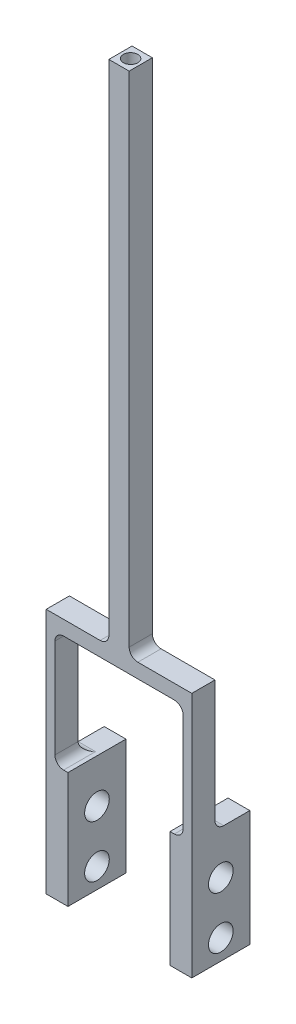
ISO-10303-21;
HEADER;
FILE_DESCRIPTION(('STEP AP214'),'2;1');
FILE_NAME('part.step','',(''),(''),'','','');
FILE_SCHEMA(('AUTOMOTIVE_DESIGN { 1 0 10303 214 1 1 1 1 }'));
ENDSEC;
DATA;
#1=APPLICATION_CONTEXT('core data for automotive mechanical design processes');
#2=APPLICATION_PROTOCOL_DEFINITION('international standard','automotive_design',2000,#1);
#3=PRODUCT_CONTEXT('',#1,'mechanical');
#4=PRODUCT('Part','Part','',(#3));
#5=PRODUCT_RELATED_PRODUCT_CATEGORY('part','',(#4));
#6=PRODUCT_DEFINITION_FORMATION('','',#4);
#7=PRODUCT_DEFINITION_CONTEXT('part definition',#1,'design');
#8=PRODUCT_DEFINITION('design','',#6,#7);
#9=PRODUCT_DEFINITION_SHAPE('','',#8);
#10=(LENGTH_UNIT() NAMED_UNIT(*) SI_UNIT(.MILLI.,.METRE.));
#11=(NAMED_UNIT(*) PLANE_ANGLE_UNIT() SI_UNIT($,.RADIAN.));
#12=(NAMED_UNIT(*) SI_UNIT($,.STERADIAN.) SOLID_ANGLE_UNIT());
#13=UNCERTAINTY_MEASURE_WITH_UNIT(LENGTH_MEASURE(1.E-05),#10,'distance_accuracy_value','');
#14=(GEOMETRIC_REPRESENTATION_CONTEXT(3) GLOBAL_UNCERTAINTY_ASSIGNED_CONTEXT((#13)) GLOBAL_UNIT_ASSIGNED_CONTEXT((#10,
#11,#12)) REPRESENTATION_CONTEXT('',''));
#15=CARTESIAN_POINT('',(0.,0.,0.));
#16=DIRECTION('',(0.,0.,1.));
#17=DIRECTION('',(1.,0.,0.));
#18=AXIS2_PLACEMENT_3D('',#15,#16,#17);
#19=CARTESIAN_POINT('',(0.,0.,-10.));
#20=DIRECTION('',(0.,0.,1.));
#21=DIRECTION('',(1.,0.,0.));
#22=AXIS2_PLACEMENT_3D('',#19,#20,#21);
#23=PLANE('',#22);
#24=DIRECTION('',(0.,1.,0.));
#25=VECTOR('',#24,1.);
#26=CARTESIAN_POINT('',(-25.1,0.,-10.));
#27=LINE('',#26,#25);
#28=CARTESIAN_POINT('',(-25.1,0.,-10.));
#29=VERTEX_POINT('',#28);
#30=CARTESIAN_POINT('',(-25.1,40.,-10.));
#31=VERTEX_POINT('',#30);
#32=EDGE_CURVE('E415',#29,#31,#27,.T.);
#33=ORIENTED_EDGE('',*,*,#32,.T.);
#34=DIRECTION('',(-1.,0.,0.));
#35=VECTOR('',#34,1.);
#36=CARTESIAN_POINT('',(0.,40.,-10.));
#37=LINE('',#36,#35);
#38=CARTESIAN_POINT('',(-17.6,40.,-10.));
#39=VERTEX_POINT('',#38);
#40=EDGE_CURVE('E427',#39,#31,#37,.T.);
#41=ORIENTED_EDGE('',*,*,#40,.F.);
#42=DIRECTION('',(0.,1.,0.));
#43=VECTOR('',#42,1.);
#44=CARTESIAN_POINT('',(-17.6,0.,-10.));
#45=LINE('',#44,#43);
#46=CARTESIAN_POINT('',(-17.6,0.,-10.));
#47=VERTEX_POINT('',#46);
#48=EDGE_CURVE('E423',#47,#39,#45,.T.);
#49=ORIENTED_EDGE('',*,*,#48,.F.);
#50=DIRECTION('',(-1.,0.,0.));
#51=VECTOR('',#50,1.);
#52=CARTESIAN_POINT('',(0.,0.,-10.));
#53=LINE('',#52,#51);
#54=EDGE_CURVE('E419',#47,#29,#53,.T.);
#55=ORIENTED_EDGE('',*,*,#54,.T.);
#56=EDGE_LOOP('',(#33,#41,#49,#55));
#57=FACE_BOUND('',#56,.T.);
#58=ADVANCED_FACE('F47',(#57),#23,.F.);
#59=CARTESIAN_POINT('',(17.6,0.,10.));
#60=DIRECTION('',(-1.,0.,0.));
#61=DIRECTION('',(0.,-1.,0.));
#62=AXIS2_PLACEMENT_3D('',#59,#60,#61);
#63=PLANE('',#62);
#64=CARTESIAN_POINT('',(17.6,7.,0.));
#65=DIRECTION('',(-1.,0.,0.));
#66=DIRECTION('',(0.,-1.,0.));
#67=AXIS2_PLACEMENT_3D('',#64,#65,#66);
#68=CIRCLE('',#67,4.25);
#69=CARTESIAN_POINT('',(17.6,2.75,0.));
#70=VERTEX_POINT('',#69);
#71=EDGE_CURVE('E269',#70,#70,#68,.T.);
#72=ORIENTED_EDGE('',*,*,#71,.F.);
#73=EDGE_LOOP('',(#72));
#74=FACE_BOUND('',#73,.T.);
#75=CARTESIAN_POINT('',(17.6,25.,0.));
#76=DIRECTION('',(-1.,0.,0.));
#77=DIRECTION('',(0.,-1.,0.));
#78=AXIS2_PLACEMENT_3D('',#75,#76,#77);
#79=CIRCLE('',#78,4.25);
#80=CARTESIAN_POINT('',(17.6,20.75,0.));
#81=VERTEX_POINT('',#80);
#82=EDGE_CURVE('E263',#81,#81,#79,.T.);
#83=ORIENTED_EDGE('',*,*,#82,.F.);
#84=EDGE_LOOP('',(#83));
#85=FACE_BOUND('',#84,.T.);
#86=DIRECTION('',(0.,1.,0.));
#87=VECTOR('',#86,1.);
#88=CARTESIAN_POINT('',(17.6,0.,-10.));
#89=LINE('',#88,#87);
#90=CARTESIAN_POINT('',(17.6,0.,-10.));
#91=VERTEX_POINT('',#90);
#92=CARTESIAN_POINT('',(17.6,40.,-10.));
#93=VERTEX_POINT('',#92);
#94=EDGE_CURVE('E405',#91,#93,#89,.T.);
#95=ORIENTED_EDGE('',*,*,#94,.F.);
#96=DIRECTION('',(0.,0.,-1.));
#97=VECTOR('',#96,1.);
#98=CARTESIAN_POINT('',(17.6,0.,10.));
#99=LINE('',#98,#97);
#100=CARTESIAN_POINT('',(17.6,0.,10.));
#101=VERTEX_POINT('',#100);
#102=EDGE_CURVE('E249',#101,#91,#99,.T.);
#103=ORIENTED_EDGE('',*,*,#102,.F.);
#104=DIRECTION('',(0.,1.,0.));
#105=VECTOR('',#104,1.);
#106=CARTESIAN_POINT('',(17.6,0.,10.));
#107=LINE('',#106,#105);
#108=CARTESIAN_POINT('',(17.6,40.,10.));
#109=VERTEX_POINT('',#108);
#110=EDGE_CURVE('E435',#101,#109,#107,.T.);
#111=ORIENTED_EDGE('',*,*,#110,.T.);
#112=DIRECTION('',(0.,0.,-1.));
#113=VECTOR('',#112,1.);
#114=CARTESIAN_POINT('',(17.6,40.,10.));
#115=LINE('',#114,#113);
#116=EDGE_CURVE('E398',#109,#93,#115,.T.);
#117=ORIENTED_EDGE('',*,*,#116,.T.);
#118=EDGE_LOOP('',(#95,#103,#111,#117));
#119=FACE_BOUND('',#118,.T.);
#120=ADVANCED_FACE('F588',(#74,#85,#119),#63,.T.);
#121=CARTESIAN_POINT('',(0.,0.,10.));
#122=DIRECTION('',(0.,1.,0.));
#123=DIRECTION('',(-1.,0.,0.));
#124=AXIS2_PLACEMENT_3D('',#121,#122,#123);
#125=PLANE('',#124);
#126=DIRECTION('',(1.,0.,0.));
#127=VECTOR('',#126,1.);
#128=CARTESIAN_POINT('',(0.,0.,-10.));
#129=LINE('',#128,#127);
#130=CARTESIAN_POINT('',(25.1,0.,-10.));
#131=VERTEX_POINT('',#130);
#132=EDGE_CURVE('E409',#91,#131,#129,.T.);
#133=ORIENTED_EDGE('',*,*,#132,.T.);
#134=DIRECTION('',(0.,0.,-1.));
#135=VECTOR('',#134,1.);
#136=CARTESIAN_POINT('',(25.1,0.,10.));
#137=LINE('',#136,#135);
#138=CARTESIAN_POINT('',(25.1,0.,10.));
#139=VERTEX_POINT('',#138);
#140=EDGE_CURVE('E243',#139,#131,#137,.T.);
#141=ORIENTED_EDGE('',*,*,#140,.F.);
#142=DIRECTION('',(1.,0.,0.));
#143=VECTOR('',#142,1.);
#144=CARTESIAN_POINT('',(0.,0.,10.));
#145=LINE('',#144,#143);
#146=EDGE_CURVE('E555',#101,#139,#145,.T.);
#147=ORIENTED_EDGE('',*,*,#146,.F.);
#148=ORIENTED_EDGE('',*,*,#102,.T.);
#149=EDGE_LOOP('',(#133,#141,#147,#148));
#150=FACE_BOUND('',#149,.T.);
#151=ADVANCED_FACE('F586',(#150),#125,.F.);
#152=CARTESIAN_POINT('',(25.1,0.,10.));
#153=DIRECTION('',(-1.,0.,0.));
#154=DIRECTION('',(0.,-1.,0.));
#155=AXIS2_PLACEMENT_3D('',#152,#153,#154);
#156=PLANE('',#155);
#157=CARTESIAN_POINT('',(25.1,7.,0.));
#158=DIRECTION('',(1.,0.,0.));
#159=DIRECTION('',(0.,0.,-1.));
#160=AXIS2_PLACEMENT_3D('',#157,#158,#159);
#161=CIRCLE('',#160,4.25);
#162=CARTESIAN_POINT('',(25.1,7.,-4.25));
#163=VERTEX_POINT('',#162);
#164=EDGE_CURVE('E532',#163,#163,#161,.T.);
#165=ORIENTED_EDGE('',*,*,#164,.F.);
#166=EDGE_LOOP('',(#165));
#167=FACE_BOUND('',#166,.T.);
#168=CARTESIAN_POINT('',(25.1,25.,0.));
#169=DIRECTION('',(1.,0.,0.));
#170=DIRECTION('',(0.,0.,-1.));
#171=AXIS2_PLACEMENT_3D('',#168,#169,#170);
#172=CIRCLE('',#171,4.25);
#173=CARTESIAN_POINT('',(25.1,25.,-4.25));
#174=VERTEX_POINT('',#173);
#175=EDGE_CURVE('E536',#174,#174,#172,.T.);
#176=ORIENTED_EDGE('',*,*,#175,.F.);
#177=EDGE_LOOP('',(#176));
#178=FACE_BOUND('',#177,.T.);
#179=DIRECTION('',(0.,1.,0.));
#180=VECTOR('',#179,1.);
#181=CARTESIAN_POINT('',(25.1,0.,-10.));
#182=LINE('',#181,#180);
#183=CARTESIAN_POINT('',(25.1,40.,-10.));
#184=VERTEX_POINT('',#183);
#185=EDGE_CURVE('E412',#131,#184,#182,.T.);
#186=ORIENTED_EDGE('',*,*,#185,.T.);
#187=DIRECTION('',(0.,0.,-1.));
#188=VECTOR('',#187,1.);
#189=CARTESIAN_POINT('',(25.1,40.,-16.6438997528933));
#190=LINE('',#189,#188);
#191=CARTESIAN_POINT('',(25.1,40.,-1.00000000000003));
#192=VERTEX_POINT('',#191);
#193=EDGE_CURVE('E237',#192,#184,#190,.T.);
#194=ORIENTED_EDGE('',*,*,#193,.F.);
#195=CARTESIAN_POINT('',(25.1,43.,-1.00000000000003));
#196=DIRECTION('',(-1.,0.,0.));
#197=DIRECTION('',(0.,-1.,0.));
#198=AXIS2_PLACEMENT_3D('',#195,#196,#197);
#199=CIRCLE('',#198,3.);
#200=CARTESIAN_POINT('',(25.1,43.,1.99999999999997));
#201=VERTEX_POINT('',#200);
#202=EDGE_CURVE('E235',#192,#201,#199,.T.);
#203=ORIENTED_EDGE('',*,*,#202,.T.);
#204=DIRECTION('',(0.,-1.,0.));
#205=VECTOR('',#204,1.);
#206=CARTESIAN_POINT('',(25.1,260.,2.));
#207=LINE('',#206,#205);
#208=CARTESIAN_POINT('',(25.1,85.,1.99999999999998));
#209=VERTEX_POINT('',#208);
#210=EDGE_CURVE('E220',#209,#201,#207,.T.);
#211=ORIENTED_EDGE('',*,*,#210,.F.);
#212=DIRECTION('',(0.,0.,-1.));
#213=VECTOR('',#212,1.);
#214=CARTESIAN_POINT('',(25.1,85.,10.));
#215=LINE('',#214,#213);
#216=CARTESIAN_POINT('',(25.1,85.,10.));
#217=VERTEX_POINT('',#216);
#218=EDGE_CURVE('E233',#217,#209,#215,.T.);
#219=ORIENTED_EDGE('',*,*,#218,.F.);
#220=DIRECTION('',(0.,1.,0.));
#221=VECTOR('',#220,1.);
#222=CARTESIAN_POINT('',(25.1,0.,10.));
#223=LINE('',#222,#221);
#224=EDGE_CURVE('E558',#139,#217,#223,.T.);
#225=ORIENTED_EDGE('',*,*,#224,.F.);
#226=ORIENTED_EDGE('',*,*,#140,.T.);
#227=EDGE_LOOP('',(#186,#194,#203,#211,#219,#225,#226));
#228=FACE_BOUND('',#227,.T.);
#229=ADVANCED_FACE('F231',(#167,#178,#228),#156,.F.);
#230=CARTESIAN_POINT('',(0.,85.,10.));
#231=DIRECTION('',(0.,-1.,0.));
#232=DIRECTION('',(0.,0.,-1.));
#233=AXIS2_PLACEMENT_3D('',#230,#231,#232);
#234=PLANE('',#233);
#235=DIRECTION('',(-1.,0.,0.));
#236=VECTOR('',#235,1.);
#237=CARTESIAN_POINT('',(0.,85.,1.99999999999998));
#238=LINE('',#237,#236);
#239=CARTESIAN_POINT('',(6.50000000000001,85.,1.99999999999998));
#240=VERTEX_POINT('',#239);
#241=EDGE_CURVE('E216',#209,#240,#238,.T.);
#242=ORIENTED_EDGE('',*,*,#241,.T.);
#243=DIRECTION('',(0.,0.,-1.));
#244=VECTOR('',#243,1.);
#245=CARTESIAN_POINT('',(6.50000000000001,85.,10.));
#246=LINE('',#245,#244);
#247=CARTESIAN_POINT('',(6.50000000000001,85.,10.));
#248=VERTEX_POINT('',#247);
#249=EDGE_CURVE('E65',#240,#248,#246,.F.);
#250=ORIENTED_EDGE('',*,*,#249,.T.);
#251=DIRECTION('',(-1.,0.,0.));
#252=VECTOR('',#251,1.);
#253=CARTESIAN_POINT('',(0.,85.,10.));
#254=LINE('',#253,#252);
#255=EDGE_CURVE('E241',#217,#248,#254,.T.);
#256=ORIENTED_EDGE('',*,*,#255,.F.);
#257=ORIENTED_EDGE('',*,*,#218,.T.);
#258=EDGE_LOOP('',(#242,#250,#256,#257));
#259=FACE_BOUND('',#258,.T.);
#260=ADVANCED_FACE('F240',(#259),#234,.F.);
#261=CARTESIAN_POINT('',(3.50000000000003,0.,10.));
#262=DIRECTION('',(-1.,0.,0.));
#263=DIRECTION('',(0.,-1.,0.));
#264=AXIS2_PLACEMENT_3D('',#261,#262,#263);
#265=PLANE('',#264);
#266=DIRECTION('',(0.,1.,0.));
#267=VECTOR('',#266,1.);
#268=CARTESIAN_POINT('',(3.50000000000003,0.,10.));
#269=LINE('',#268,#267);
#270=CARTESIAN_POINT('',(3.50000000000001,88.,10.));
#271=VERTEX_POINT('',#270);
#272=CARTESIAN_POINT('',(3.49999999999997,260.,10.));
#273=VERTEX_POINT('',#272);
#274=EDGE_CURVE('E469',#271,#273,#269,.T.);
#275=ORIENTED_EDGE('',*,*,#274,.F.);
#276=DIRECTION('',(0.,0.,-1.));
#277=VECTOR('',#276,1.);
#278=CARTESIAN_POINT('',(3.50000000000001,88.,1.99999999999998));
#279=LINE('',#278,#277);
#280=CARTESIAN_POINT('',(3.50000000000001,88.,1.99999999999998));
#281=VERTEX_POINT('',#280);
#282=EDGE_CURVE('E320',#271,#281,#279,.T.);
#283=ORIENTED_EDGE('',*,*,#282,.T.);
#284=DIRECTION('',(0.,1.,0.));
#285=VECTOR('',#284,1.);
#286=CARTESIAN_POINT('',(3.50000000000003,0.,1.99999999999997));
#287=LINE('',#286,#285);
#288=CARTESIAN_POINT('',(3.49999999999997,260.,2.));
#289=VERTEX_POINT('',#288);
#290=EDGE_CURVE('E226',#281,#289,#287,.T.);
#291=ORIENTED_EDGE('',*,*,#290,.T.);
#292=DIRECTION('',(0.,0.,-1.));
#293=VECTOR('',#292,1.);
#294=CARTESIAN_POINT('',(3.49999999999997,260.,10.));
#295=LINE('',#294,#293);
#296=EDGE_CURVE('E244',#273,#289,#295,.T.);
#297=ORIENTED_EDGE('',*,*,#296,.F.);
#298=EDGE_LOOP('',(#275,#283,#291,#297));
#299=FACE_BOUND('',#298,.T.);
#300=ADVANCED_FACE('F564',(#299),#265,.F.);
#301=CARTESIAN_POINT('',(0.,260.,10.));
#302=DIRECTION('',(0.,1.,0.));
#303=DIRECTION('',(0.,0.,1.));
#304=AXIS2_PLACEMENT_3D('',#301,#302,#303);
#305=PLANE('',#304);
#306=CARTESIAN_POINT('',(0.,260.,6.));
#307=DIRECTION('',(0.,1.,0.));
#308=DIRECTION('',(0.,0.,1.));
#309=AXIS2_PLACEMENT_3D('',#306,#307,#308);
#310=CIRCLE('',#309,2.5);
#311=CARTESIAN_POINT('',(0.,260.,3.5));
#312=VERTEX_POINT('',#311);
#313=EDGE_CURVE('E238',#312,#312,#310,.F.);
#314=ORIENTED_EDGE('',*,*,#313,.T.);
#315=EDGE_LOOP('',(#314));
#316=FACE_BOUND('',#315,.T.);
#317=DIRECTION('',(1.,0.,0.));
#318=VECTOR('',#317,1.);
#319=CARTESIAN_POINT('',(-25.1,260.,2.));
#320=LINE('',#319,#318);
#321=CARTESIAN_POINT('',(-3.50000000000003,260.,2.));
#322=VERTEX_POINT('',#321);
#323=EDGE_CURVE('E467',#322,#289,#320,.T.);
#324=ORIENTED_EDGE('',*,*,#323,.F.);
#325=DIRECTION('',(0.,0.,-1.));
#326=VECTOR('',#325,1.);
#327=CARTESIAN_POINT('',(-3.50000000000003,260.,10.));
#328=LINE('',#327,#326);
#329=CARTESIAN_POINT('',(-3.50000000000003,260.,10.));
#330=VERTEX_POINT('',#329);
#331=EDGE_CURVE('E252',#330,#322,#328,.T.);
#332=ORIENTED_EDGE('',*,*,#331,.F.);
#333=DIRECTION('',(1.,0.,0.));
#334=VECTOR('',#333,1.);
#335=CARTESIAN_POINT('',(0.,260.,10.));
#336=LINE('',#335,#334);
#337=EDGE_CURVE('E465',#330,#273,#336,.T.);
#338=ORIENTED_EDGE('',*,*,#337,.T.);
#339=ORIENTED_EDGE('',*,*,#296,.T.);
#340=EDGE_LOOP('',(#324,#332,#338,#339));
#341=FACE_BOUND('',#340,.T.);
#342=ADVANCED_FACE('F464',(#316,#341),#305,.T.);
#343=CARTESIAN_POINT('',(-3.50000000000003,0.,10.));
#344=DIRECTION('',(-1.,0.,0.));
#345=DIRECTION('',(0.,0.,1.));
#346=AXIS2_PLACEMENT_3D('',#343,#344,#345);
#347=PLANE('',#346);
#348=DIRECTION('',(0.,1.,0.));
#349=VECTOR('',#348,1.);
#350=CARTESIAN_POINT('',(-3.50000000000003,0.,1.99999999999997));
#351=LINE('',#350,#349);
#352=CARTESIAN_POINT('',(-3.50000000000003,88.,1.99999999999998));
#353=VERTEX_POINT('',#352);
#354=EDGE_CURVE('E456',#353,#322,#351,.T.);
#355=ORIENTED_EDGE('',*,*,#354,.F.);
#356=DIRECTION('',(0.,0.,-1.));
#357=VECTOR('',#356,1.);
#358=CARTESIAN_POINT('',(-3.50000000000003,88.,10.));
#359=LINE('',#358,#357);
#360=CARTESIAN_POINT('',(-3.50000000000003,88.,10.));
#361=VERTEX_POINT('',#360);
#362=EDGE_CURVE('E317',#353,#361,#359,.F.);
#363=ORIENTED_EDGE('',*,*,#362,.T.);
#364=DIRECTION('',(0.,1.,0.));
#365=VECTOR('',#364,1.);
#366=CARTESIAN_POINT('',(-3.50000000000003,0.,10.));
#367=LINE('',#366,#365);
#368=EDGE_CURVE('E459',#361,#330,#367,.T.);
#369=ORIENTED_EDGE('',*,*,#368,.T.);
#370=ORIENTED_EDGE('',*,*,#331,.T.);
#371=EDGE_LOOP('',(#355,#363,#369,#370));
#372=FACE_BOUND('',#371,.T.);
#373=ADVANCED_FACE('F455',(#372),#347,.T.);
#374=CARTESIAN_POINT('',(0.,85.,10.));
#375=DIRECTION('',(0.,1.,0.));
#376=DIRECTION('',(0.,0.,1.));
#377=AXIS2_PLACEMENT_3D('',#374,#375,#376);
#378=PLANE('',#377);
#379=DIRECTION('',(1.,0.,0.));
#380=VECTOR('',#379,1.);
#381=CARTESIAN_POINT('',(0.,85.,10.));
#382=LINE('',#381,#380);
#383=CARTESIAN_POINT('',(-25.1,85.,10.));
#384=VERTEX_POINT('',#383);
#385=CARTESIAN_POINT('',(-6.50000000000003,85.,10.));
#386=VERTEX_POINT('',#385);
#387=EDGE_CURVE('E475',#384,#386,#382,.T.);
#388=ORIENTED_EDGE('',*,*,#387,.T.);
#389=DIRECTION('',(0.,0.,-1.));
#390=VECTOR('',#389,1.);
#391=CARTESIAN_POINT('',(-6.50000000000003,85.,1.99999999999998));
#392=LINE('',#391,#390);
#393=CARTESIAN_POINT('',(-6.50000000000003,85.,1.99999999999998));
#394=VERTEX_POINT('',#393);
#395=EDGE_CURVE('E313',#386,#394,#392,.T.);
#396=ORIENTED_EDGE('',*,*,#395,.T.);
#397=DIRECTION('',(1.,0.,0.));
#398=VECTOR('',#397,1.);
#399=CARTESIAN_POINT('',(0.,85.,1.99999999999998));
#400=LINE('',#399,#398);
#401=CARTESIAN_POINT('',(-25.1,85.,1.99999999999998));
#402=VERTEX_POINT('',#401);
#403=EDGE_CURVE('E520',#402,#394,#400,.T.);
#404=ORIENTED_EDGE('',*,*,#403,.F.);
#405=DIRECTION('',(0.,0.,-1.));
#406=VECTOR('',#405,1.);
#407=CARTESIAN_POINT('',(-25.1,85.,10.));
#408=LINE('',#407,#406);
#409=EDGE_CURVE('E447',#384,#402,#408,.T.);
#410=ORIENTED_EDGE('',*,*,#409,.F.);
#411=EDGE_LOOP('',(#388,#396,#404,#410));
#412=FACE_BOUND('',#411,.T.);
#413=ADVANCED_FACE('F631',(#412),#378,.T.);
#414=CARTESIAN_POINT('',(-25.1,0.,10.));
#415=DIRECTION('',(-1.,0.,0.));
#416=DIRECTION('',(0.,0.,1.));
#417=AXIS2_PLACEMENT_3D('',#414,#415,#416);
#418=PLANE('',#417);
#419=DIRECTION('',(0.,-1.,0.));
#420=VECTOR('',#419,1.);
#421=CARTESIAN_POINT('',(-25.1,260.,2.));
#422=LINE('',#421,#420);
#423=CARTESIAN_POINT('',(-25.1,43.,1.99999999999997));
#424=VERTEX_POINT('',#423);
#425=EDGE_CURVE('E568',#402,#424,#422,.T.);
#426=ORIENTED_EDGE('',*,*,#425,.T.);
#427=CARTESIAN_POINT('',(-25.1,43.,-1.00000000000003));
#428=DIRECTION('',(-1.,0.,0.));
#429=DIRECTION('',(0.,0.,1.));
#430=AXIS2_PLACEMENT_3D('',#427,#428,#429);
#431=CIRCLE('',#430,3.);
#432=CARTESIAN_POINT('',(-25.1,40.,-1.00000000000003));
#433=VERTEX_POINT('',#432);
#434=EDGE_CURVE('E332',#424,#433,#431,.F.);
#435=ORIENTED_EDGE('',*,*,#434,.T.);
#436=DIRECTION('',(0.,0.,-1.));
#437=VECTOR('',#436,1.);
#438=CARTESIAN_POINT('',(-25.1,40.,-16.6438997528933));
#439=LINE('',#438,#437);
#440=EDGE_CURVE('E566',#433,#31,#439,.T.);
#441=ORIENTED_EDGE('',*,*,#440,.T.);
#442=ORIENTED_EDGE('',*,*,#32,.F.);
#443=DIRECTION('',(0.,0.,-1.));
#444=VECTOR('',#443,1.);
#445=CARTESIAN_POINT('',(-25.1,0.,10.));
#446=LINE('',#445,#444);
#447=CARTESIAN_POINT('',(-25.1,0.,10.));
#448=VERTEX_POINT('',#447);
#449=EDGE_CURVE('E444',#448,#29,#446,.T.);
#450=ORIENTED_EDGE('',*,*,#449,.F.);
#451=DIRECTION('',(0.,1.,0.));
#452=VECTOR('',#451,1.);
#453=CARTESIAN_POINT('',(-25.1,0.,10.));
#454=LINE('',#453,#452);
#455=EDGE_CURVE('E483',#448,#384,#454,.T.);
#456=ORIENTED_EDGE('',*,*,#455,.T.);
#457=ORIENTED_EDGE('',*,*,#409,.T.);
#458=EDGE_LOOP('',(#426,#435,#441,#442,#450,#456,#457));
#459=FACE_BOUND('',#458,.T.);
#460=CARTESIAN_POINT('',(-25.1,7.,0.));
#461=DIRECTION('',(1.,0.,0.));
#462=DIRECTION('',(0.,0.,-1.));
#463=AXIS2_PLACEMENT_3D('',#460,#461,#462);
#464=CIRCLE('',#463,4.25);
#465=CARTESIAN_POINT('',(-25.1,7.,-4.25));
#466=VERTEX_POINT('',#465);
#467=EDGE_CURVE('E264',#466,#466,#464,.T.);
#468=ORIENTED_EDGE('',*,*,#467,.T.);
#469=EDGE_LOOP('',(#468));
#470=FACE_BOUND('',#469,.T.);
#471=CARTESIAN_POINT('',(-25.1,25.,0.));
#472=DIRECTION('',(1.,0.,0.));
#473=DIRECTION('',(0.,0.,-1.));
#474=AXIS2_PLACEMENT_3D('',#471,#472,#473);
#475=CIRCLE('',#474,4.25);
#476=CARTESIAN_POINT('',(-25.1,25.,-4.25));
#477=VERTEX_POINT('',#476);
#478=EDGE_CURVE('E225',#477,#477,#475,.T.);
#479=ORIENTED_EDGE('',*,*,#478,.T.);
#480=EDGE_LOOP('',(#479));
#481=FACE_BOUND('',#480,.T.);
#482=ADVANCED_FACE('F634',(#459,#470,#481),#418,.T.);
#483=CARTESIAN_POINT('',(0.,0.,10.));
#484=DIRECTION('',(0.,-1.,0.));
#485=DIRECTION('',(1.,0.,0.));
#486=AXIS2_PLACEMENT_3D('',#483,#484,#485);
#487=PLANE('',#486);
#488=ORIENTED_EDGE('',*,*,#54,.F.);
#489=DIRECTION('',(0.,0.,-1.));
#490=VECTOR('',#489,1.);
#491=CARTESIAN_POINT('',(-17.6,0.,10.));
#492=LINE('',#491,#490);
#493=CARTESIAN_POINT('',(-17.6,0.,10.));
#494=VERTEX_POINT('',#493);
#495=EDGE_CURVE('E441',#494,#47,#492,.T.);
#496=ORIENTED_EDGE('',*,*,#495,.F.);
#497=DIRECTION('',(-1.,0.,0.));
#498=VECTOR('',#497,1.);
#499=CARTESIAN_POINT('',(0.,0.,10.));
#500=LINE('',#499,#498);
#501=EDGE_CURVE('E487',#494,#448,#500,.T.);
#502=ORIENTED_EDGE('',*,*,#501,.T.);
#503=ORIENTED_EDGE('',*,*,#449,.T.);
#504=EDGE_LOOP('',(#488,#496,#502,#503));
#505=FACE_BOUND('',#504,.T.);
#506=ADVANCED_FACE('F641',(#505),#487,.T.);
#507=CARTESIAN_POINT('',(-17.6,0.,10.));
#508=DIRECTION('',(-1.,0.,0.));
#509=DIRECTION('',(0.,-1.,0.));
#510=AXIS2_PLACEMENT_3D('',#507,#508,#509);
#511=PLANE('',#510);
#512=CARTESIAN_POINT('',(-17.6,7.,0.));
#513=DIRECTION('',(-1.,0.,0.));
#514=DIRECTION('',(0.,-1.,0.));
#515=AXIS2_PLACEMENT_3D('',#512,#513,#514);
#516=CIRCLE('',#515,4.25);
#517=CARTESIAN_POINT('',(-17.6,2.75,0.));
#518=VERTEX_POINT('',#517);
#519=EDGE_CURVE('E265',#518,#518,#516,.T.);
#520=ORIENTED_EDGE('',*,*,#519,.T.);
#521=EDGE_LOOP('',(#520));
#522=FACE_BOUND('',#521,.T.);
#523=CARTESIAN_POINT('',(-17.6,25.,0.));
#524=DIRECTION('',(-1.,0.,0.));
#525=DIRECTION('',(0.,-1.,0.));
#526=AXIS2_PLACEMENT_3D('',#523,#524,#525);
#527=CIRCLE('',#526,4.25);
#528=CARTESIAN_POINT('',(-17.6,20.75,0.));
#529=VERTEX_POINT('',#528);
#530=EDGE_CURVE('E259',#529,#529,#527,.T.);
#531=ORIENTED_EDGE('',*,*,#530,.T.);
#532=EDGE_LOOP('',(#531));
#533=FACE_BOUND('',#532,.T.);
#534=ORIENTED_EDGE('',*,*,#48,.T.);
#535=DIRECTION('',(0.,0.,-1.));
#536=VECTOR('',#535,1.);
#537=CARTESIAN_POINT('',(-17.6,40.,10.));
#538=LINE('',#537,#536);
#539=CARTESIAN_POINT('',(-17.6,40.,10.));
#540=VERTEX_POINT('',#539);
#541=EDGE_CURVE('E438',#540,#39,#538,.T.);
#542=ORIENTED_EDGE('',*,*,#541,.F.);
#543=DIRECTION('',(0.,1.,0.));
#544=VECTOR('',#543,1.);
#545=CARTESIAN_POINT('',(-17.6,0.,10.));
#546=LINE('',#545,#544);
#547=EDGE_CURVE('E491',#494,#540,#546,.T.);
#548=ORIENTED_EDGE('',*,*,#547,.F.);
#549=ORIENTED_EDGE('',*,*,#495,.T.);
#550=EDGE_LOOP('',(#534,#542,#548,#549));
#551=FACE_BOUND('',#550,.T.);
#552=ADVANCED_FACE('F646',(#522,#533,#551),#511,.F.);
#553=CARTESIAN_POINT('',(0.,40.,10.));
#554=DIRECTION('',(0.,-1.,0.));
#555=DIRECTION('',(0.,0.,-1.));
#556=AXIS2_PLACEMENT_3D('',#553,#554,#555);
#557=PLANE('',#556);
#558=ORIENTED_EDGE('',*,*,#440,.F.);
#559=DIRECTION('',(1.,0.,0.));
#560=VECTOR('',#559,1.);
#561=CARTESIAN_POINT('',(-22.1,40.,-1.00000000000003));
#562=LINE('',#561,#560);
#563=CARTESIAN_POINT('',(-19.1,40.,-1.00000000000003));
#564=VERTEX_POINT('',#563);
#565=EDGE_CURVE('E289',#433,#564,#562,.T.);
#566=ORIENTED_EDGE('',*,*,#565,.T.);
#567=DIRECTION('',(0.,0.,-1.));
#568=VECTOR('',#567,1.);
#569=CARTESIAN_POINT('',(-19.1,40.,10.));
#570=LINE('',#569,#568);
#571=CARTESIAN_POINT('',(-19.1,40.,10.));
#572=VERTEX_POINT('',#571);
#573=EDGE_CURVE('E286',#564,#572,#570,.F.);
#574=ORIENTED_EDGE('',*,*,#573,.T.);
#575=DIRECTION('',(-1.,0.,0.));
#576=VECTOR('',#575,1.);
#577=CARTESIAN_POINT('',(0.,40.,10.));
#578=LINE('',#577,#576);
#579=EDGE_CURVE('E494',#540,#572,#578,.T.);
#580=ORIENTED_EDGE('',*,*,#579,.F.);
#581=ORIENTED_EDGE('',*,*,#541,.T.);
#582=ORIENTED_EDGE('',*,*,#40,.T.);
#583=EDGE_LOOP('',(#558,#566,#574,#580,#581,#582));
#584=FACE_BOUND('',#583,.T.);
#585=ADVANCED_FACE('F651',(#584),#557,.F.);
#586=CARTESIAN_POINT('',(-22.1,0.,10.));
#587=DIRECTION('',(-1.,0.,0.));
#588=DIRECTION('',(0.,0.,1.));
#589=AXIS2_PLACEMENT_3D('',#586,#587,#588);
#590=PLANE('',#589);
#591=DIRECTION('',(0.,1.,0.));
#592=VECTOR('',#591,1.);
#593=CARTESIAN_POINT('',(-22.1,0.,1.99999999999997));
#594=LINE('',#593,#592);
#595=CARTESIAN_POINT('',(-22.1,43.,1.99999999999997));
#596=VERTEX_POINT('',#595);
#597=CARTESIAN_POINT('',(-22.1,77.,1.99999999999998));
#598=VERTEX_POINT('',#597);
#599=EDGE_CURVE('E516',#596,#598,#594,.T.);
#600=ORIENTED_EDGE('',*,*,#599,.T.);
#601=DIRECTION('',(0.,0.,-1.));
#602=VECTOR('',#601,1.);
#603=CARTESIAN_POINT('',(-22.1,77.,10.));
#604=LINE('',#603,#602);
#605=CARTESIAN_POINT('',(-22.1,77.,10.));
#606=VERTEX_POINT('',#605);
#607=EDGE_CURVE('E283',#598,#606,#604,.F.);
#608=ORIENTED_EDGE('',*,*,#607,.T.);
#609=DIRECTION('',(0.,1.,0.));
#610=VECTOR('',#609,1.);
#611=CARTESIAN_POINT('',(-22.1,0.,10.));
#612=LINE('',#611,#610);
#613=CARTESIAN_POINT('',(-22.1,43.,10.));
#614=VERTEX_POINT('',#613);
#615=EDGE_CURVE('E401',#614,#606,#612,.T.);
#616=ORIENTED_EDGE('',*,*,#615,.F.);
#617=DIRECTION('',(0.,0.,-1.));
#618=VECTOR('',#617,1.);
#619=CARTESIAN_POINT('',(-22.1,43.,1.99999999999997));
#620=LINE('',#619,#618);
#621=EDGE_CURVE('E280',#614,#596,#620,.T.);
#622=ORIENTED_EDGE('',*,*,#621,.T.);
#623=EDGE_LOOP('',(#600,#608,#616,#622));
#624=FACE_BOUND('',#623,.T.);
#625=ADVANCED_FACE('F649',(#624),#590,.F.);
#626=CARTESIAN_POINT('',(0.,80.,10.));
#627=DIRECTION('',(0.,-1.,0.));
#628=DIRECTION('',(0.,0.,-1.));
#629=AXIS2_PLACEMENT_3D('',#626,#627,#628);
#630=PLANE('',#629);
#631=DIRECTION('',(-1.,0.,0.));
#632=VECTOR('',#631,1.);
#633=CARTESIAN_POINT('',(0.,80.,10.));
#634=LINE('',#633,#632);
#635=CARTESIAN_POINT('',(19.1,80.,10.));
#636=VERTEX_POINT('',#635);
#637=CARTESIAN_POINT('',(-19.1,80.,10.));
#638=VERTEX_POINT('',#637);
#639=EDGE_CURVE('E394',#636,#638,#634,.T.);
#640=ORIENTED_EDGE('',*,*,#639,.T.);
#641=DIRECTION('',(0.,0.,-1.));
#642=VECTOR('',#641,1.);
#643=CARTESIAN_POINT('',(-19.1,80.,10.));
#644=LINE('',#643,#642);
#645=CARTESIAN_POINT('',(-19.1,80.,1.99999999999998));
#646=VERTEX_POINT('',#645);
#647=EDGE_CURVE('E276',#638,#646,#644,.T.);
#648=ORIENTED_EDGE('',*,*,#647,.T.);
#649=DIRECTION('',(-1.,0.,0.));
#650=VECTOR('',#649,1.);
#651=CARTESIAN_POINT('',(0.,80.,1.99999999999998));
#652=LINE('',#651,#650);
#653=CARTESIAN_POINT('',(19.1,80.,1.99999999999998));
#654=VERTEX_POINT('',#653);
#655=EDGE_CURVE('E512',#654,#646,#652,.T.);
#656=ORIENTED_EDGE('',*,*,#655,.F.);
#657=DIRECTION('',(0.,0.,-1.));
#658=VECTOR('',#657,1.);
#659=CARTESIAN_POINT('',(19.1,80.,10.));
#660=LINE('',#659,#658);
#661=EDGE_CURVE('E258',#654,#636,#660,.F.);
#662=ORIENTED_EDGE('',*,*,#661,.T.);
#663=EDGE_LOOP('',(#640,#648,#656,#662));
#664=FACE_BOUND('',#663,.T.);
#665=ADVANCED_FACE('F511',(#664),#630,.T.);
#666=CARTESIAN_POINT('',(22.1,0.,10.));
#667=DIRECTION('',(-1.,0.,0.));
#668=DIRECTION('',(0.,-1.,0.));
#669=AXIS2_PLACEMENT_3D('',#666,#667,#668);
#670=PLANE('',#669);
#671=DIRECTION('',(0.,1.,0.));
#672=VECTOR('',#671,1.);
#673=CARTESIAN_POINT('',(22.1,0.,10.));
#674=LINE('',#673,#672);
#675=CARTESIAN_POINT('',(22.1,43.,10.));
#676=VERTEX_POINT('',#675);
#677=CARTESIAN_POINT('',(22.1,77.,10.));
#678=VERTEX_POINT('',#677);
#679=EDGE_CURVE('E382',#676,#678,#674,.T.);
#680=ORIENTED_EDGE('',*,*,#679,.T.);
#681=DIRECTION('',(0.,0.,-1.));
#682=VECTOR('',#681,1.);
#683=CARTESIAN_POINT('',(22.1,77.,1.99999999999998));
#684=LINE('',#683,#682);
#685=CARTESIAN_POINT('',(22.1,77.,1.99999999999998));
#686=VERTEX_POINT('',#685);
#687=EDGE_CURVE('E302',#678,#686,#684,.T.);
#688=ORIENTED_EDGE('',*,*,#687,.T.);
#689=DIRECTION('',(0.,1.,0.));
#690=VECTOR('',#689,1.);
#691=CARTESIAN_POINT('',(22.1,0.,1.99999999999997));
#692=LINE('',#691,#690);
#693=CARTESIAN_POINT('',(22.1,43.,1.99999999999997));
#694=VERTEX_POINT('',#693);
#695=EDGE_CURVE('E385',#694,#686,#692,.T.);
#696=ORIENTED_EDGE('',*,*,#695,.F.);
#697=DIRECTION('',(0.,0.,-1.));
#698=VECTOR('',#697,1.);
#699=CARTESIAN_POINT('',(22.1,43.,10.));
#700=LINE('',#699,#698);
#701=EDGE_CURVE('E299',#694,#676,#700,.F.);
#702=ORIENTED_EDGE('',*,*,#701,.T.);
#703=EDGE_LOOP('',(#680,#688,#696,#702));
#704=FACE_BOUND('',#703,.T.);
#705=ADVANCED_FACE('F381',(#704),#670,.T.);
#706=CARTESIAN_POINT('',(0.,40.,10.));
#707=DIRECTION('',(0.,1.,0.));
#708=DIRECTION('',(0.,0.,1.));
#709=AXIS2_PLACEMENT_3D('',#706,#707,#708);
#710=PLANE('',#709);
#711=DIRECTION('',(0.,0.,-1.));
#712=VECTOR('',#711,1.);
#713=CARTESIAN_POINT('',(19.1,40.,1.99999999999997));
#714=LINE('',#713,#712);
#715=CARTESIAN_POINT('',(19.1,40.,10.));
#716=VERTEX_POINT('',#715);
#717=CARTESIAN_POINT('',(19.1,40.,-1.00000000000003));
#718=VERTEX_POINT('',#717);
#719=EDGE_CURVE('E306',#716,#718,#714,.T.);
#720=ORIENTED_EDGE('',*,*,#719,.T.);
#721=DIRECTION('',(1.,0.,0.));
#722=VECTOR('',#721,1.);
#723=CARTESIAN_POINT('',(0.,40.,-1.00000000000003));
#724=LINE('',#723,#722);
#725=EDGE_CURVE('E309',#718,#192,#724,.T.);
#726=ORIENTED_EDGE('',*,*,#725,.T.);
#727=ORIENTED_EDGE('',*,*,#193,.T.);
#728=DIRECTION('',(1.,0.,0.));
#729=VECTOR('',#728,1.);
#730=CARTESIAN_POINT('',(0.,40.,-10.));
#731=LINE('',#730,#729);
#732=EDGE_CURVE('E431',#93,#184,#731,.T.);
#733=ORIENTED_EDGE('',*,*,#732,.F.);
#734=ORIENTED_EDGE('',*,*,#116,.F.);
#735=DIRECTION('',(1.,0.,0.));
#736=VECTOR('',#735,1.);
#737=CARTESIAN_POINT('',(0.,40.,10.));
#738=LINE('',#737,#736);
#739=EDGE_CURVE('E393',#109,#716,#738,.T.);
#740=ORIENTED_EDGE('',*,*,#739,.T.);
#741=EDGE_LOOP('',(#720,#726,#727,#733,#734,#740));
#742=FACE_BOUND('',#741,.T.);
#743=ADVANCED_FACE('F577',(#742),#710,.T.);
#744=CARTESIAN_POINT('',(0.,0.,10.));
#745=DIRECTION('',(0.,0.,1.));
#746=DIRECTION('',(1.,0.,0.));
#747=AXIS2_PLACEMENT_3D('',#744,#745,#746);
#748=PLANE('',#747);
#749=ORIENTED_EDGE('',*,*,#110,.F.);
#750=ORIENTED_EDGE('',*,*,#146,.T.);
#751=ORIENTED_EDGE('',*,*,#224,.T.);
#752=ORIENTED_EDGE('',*,*,#255,.T.);
#753=CARTESIAN_POINT('',(6.50000000000001,88.,10.));
#754=DIRECTION('',(0.,0.,1.));
#755=DIRECTION('',(1.,0.,0.));
#756=AXIS2_PLACEMENT_3D('',#753,#754,#755);
#757=CIRCLE('',#756,3.);
#758=EDGE_CURVE('E11',#248,#271,#757,.F.);
#759=ORIENTED_EDGE('',*,*,#758,.T.);
#760=ORIENTED_EDGE('',*,*,#274,.T.);
#761=ORIENTED_EDGE('',*,*,#337,.F.);
#762=ORIENTED_EDGE('',*,*,#368,.F.);
#763=CARTESIAN_POINT('',(-6.50000000000003,88.,10.));
#764=DIRECTION('',(0.,0.,1.));
#765=DIRECTION('',(1.,0.,0.));
#766=AXIS2_PLACEMENT_3D('',#763,#764,#765);
#767=CIRCLE('',#766,3.);
#768=EDGE_CURVE('E352',#361,#386,#767,.F.);
#769=ORIENTED_EDGE('',*,*,#768,.T.);
#770=ORIENTED_EDGE('',*,*,#387,.F.);
#771=ORIENTED_EDGE('',*,*,#455,.F.);
#772=ORIENTED_EDGE('',*,*,#501,.F.);
#773=ORIENTED_EDGE('',*,*,#547,.T.);
#774=ORIENTED_EDGE('',*,*,#579,.T.);
#775=CARTESIAN_POINT('',(-19.1,43.,10.));
#776=DIRECTION('',(0.,0.,1.));
#777=DIRECTION('',(1.,0.,0.));
#778=AXIS2_PLACEMENT_3D('',#775,#776,#777);
#779=CIRCLE('',#778,3.);
#780=EDGE_CURVE('E335',#572,#614,#779,.F.);
#781=ORIENTED_EDGE('',*,*,#780,.T.);
#782=ORIENTED_EDGE('',*,*,#615,.T.);
#783=CARTESIAN_POINT('',(-19.1,77.,10.));
#784=DIRECTION('',(0.,0.,1.));
#785=DIRECTION('',(1.,0.,0.));
#786=AXIS2_PLACEMENT_3D('',#783,#784,#785);
#787=CIRCLE('',#786,3.);
#788=EDGE_CURVE('E329',#606,#638,#787,.F.);
#789=ORIENTED_EDGE('',*,*,#788,.T.);
#790=ORIENTED_EDGE('',*,*,#639,.F.);
#791=CARTESIAN_POINT('',(19.1,77.,10.));
#792=DIRECTION('',(0.,0.,1.));
#793=DIRECTION('',(1.,0.,0.));
#794=AXIS2_PLACEMENT_3D('',#791,#792,#793);
#795=CIRCLE('',#794,3.);
#796=EDGE_CURVE('E341',#636,#678,#795,.F.);
#797=ORIENTED_EDGE('',*,*,#796,.T.);
#798=ORIENTED_EDGE('',*,*,#679,.F.);
#799=CARTESIAN_POINT('',(19.1,43.,10.));
#800=DIRECTION('',(0.,0.,1.));
#801=DIRECTION('',(1.,0.,0.));
#802=AXIS2_PLACEMENT_3D('',#799,#800,#801);
#803=CIRCLE('',#802,3.);
#804=EDGE_CURVE('E346',#676,#716,#803,.F.);
#805=ORIENTED_EDGE('',*,*,#804,.T.);
#806=ORIENTED_EDGE('',*,*,#739,.F.);
#807=EDGE_LOOP('',(#749,#750,#751,#752,#759,#760,#761,#762,#769,#770,#771,#772,#773,#774,#781,
#782,#789,#790,#797,#798,#805,#806));
#808=FACE_BOUND('',#807,.T.);
#809=ADVANCED_FACE('F387',(#808),#748,.T.);
#810=ORIENTED_EDGE('',*,*,#732,.T.);
#811=ORIENTED_EDGE('',*,*,#185,.F.);
#812=ORIENTED_EDGE('',*,*,#132,.F.);
#813=ORIENTED_EDGE('',*,*,#94,.T.);
#814=EDGE_LOOP('',(#810,#811,#812,#813));
#815=FACE_BOUND('',#814,.T.);
#816=ADVANCED_FACE('F580',(#815),#23,.F.);
#817=CARTESIAN_POINT('',(-25.1,25.,0.));
#818=DIRECTION('',(1.,0.,0.));
#819=DIRECTION('',(0.,0.,-1.));
#820=AXIS2_PLACEMENT_3D('',#817,#818,#819);
#821=CYLINDRICAL_SURFACE('',#820,4.25);
#822=ORIENTED_EDGE('',*,*,#478,.F.);
#823=EDGE_LOOP('',(#822));
#824=FACE_BOUND('',#823,.T.);
#825=ORIENTED_EDGE('',*,*,#530,.F.);
#826=EDGE_LOOP('',(#825));
#827=FACE_BOUND('',#826,.T.);
#828=ADVANCED_FACE('F692',(#824,#827),#821,.F.);
#829=CARTESIAN_POINT('',(-25.1,7.,0.));
#830=DIRECTION('',(1.,0.,0.));
#831=DIRECTION('',(0.,0.,-1.));
#832=AXIS2_PLACEMENT_3D('',#829,#830,#831);
#833=CYLINDRICAL_SURFACE('',#832,4.25);
#834=ORIENTED_EDGE('',*,*,#467,.F.);
#835=EDGE_LOOP('',(#834));
#836=FACE_BOUND('',#835,.T.);
#837=ORIENTED_EDGE('',*,*,#519,.F.);
#838=EDGE_LOOP('',(#837));
#839=FACE_BOUND('',#838,.T.);
#840=ADVANCED_FACE('F689',(#836,#839),#833,.F.);
#841=ORIENTED_EDGE('',*,*,#82,.T.);
#842=EDGE_LOOP('',(#841));
#843=FACE_BOUND('',#842,.T.);
#844=ORIENTED_EDGE('',*,*,#175,.T.);
#845=EDGE_LOOP('',(#844));
#846=FACE_BOUND('',#845,.T.);
#847=ADVANCED_FACE('F686',(#843,#846),#821,.F.);
#848=ORIENTED_EDGE('',*,*,#71,.T.);
#849=EDGE_LOOP('',(#848));
#850=FACE_BOUND('',#849,.T.);
#851=ORIENTED_EDGE('',*,*,#164,.T.);
#852=EDGE_LOOP('',(#851));
#853=FACE_BOUND('',#852,.T.);
#854=ADVANCED_FACE('F688',(#850,#853),#833,.F.);
#855=CARTESIAN_POINT('',(-25.1,260.,2.));
#856=DIRECTION('',(0.,0.,1.));
#857=DIRECTION('',(0.,-1.,0.));
#858=AXIS2_PLACEMENT_3D('',#855,#856,#857);
#859=PLANE('',#858);
#860=ORIENTED_EDGE('',*,*,#599,.F.);
#861=DIRECTION('',(1.,0.,0.));
#862=VECTOR('',#861,1.);
#863=CARTESIAN_POINT('',(-25.1,43.,1.99999999999997));
#864=LINE('',#863,#862);
#865=EDGE_CURVE('E296',#596,#424,#864,.F.);
#866=ORIENTED_EDGE('',*,*,#865,.T.);
#867=ORIENTED_EDGE('',*,*,#425,.F.);
#868=ORIENTED_EDGE('',*,*,#403,.T.);
#869=CARTESIAN_POINT('',(-6.50000000000003,88.,1.99999999999998));
#870=DIRECTION('',(0.,0.,1.));
#871=DIRECTION('',(0.,-1.,0.));
#872=AXIS2_PLACEMENT_3D('',#869,#870,#871);
#873=CIRCLE('',#872,3.);
#874=EDGE_CURVE('E349',#394,#353,#873,.T.);
#875=ORIENTED_EDGE('',*,*,#874,.T.);
#876=ORIENTED_EDGE('',*,*,#354,.T.);
#877=ORIENTED_EDGE('',*,*,#323,.T.);
#878=ORIENTED_EDGE('',*,*,#290,.F.);
#879=CARTESIAN_POINT('',(6.50000000000001,88.,1.99999999999998));
#880=DIRECTION('',(0.,0.,1.));
#881=DIRECTION('',(0.,-1.,0.));
#882=AXIS2_PLACEMENT_3D('',#879,#880,#881);
#883=CIRCLE('',#882,3.);
#884=EDGE_CURVE('E57',#281,#240,#883,.T.);
#885=ORIENTED_EDGE('',*,*,#884,.T.);
#886=ORIENTED_EDGE('',*,*,#241,.F.);
#887=ORIENTED_EDGE('',*,*,#210,.T.);
#888=DIRECTION('',(1.,0.,0.));
#889=VECTOR('',#888,1.);
#890=CARTESIAN_POINT('',(-25.1,43.,1.99999999999997));
#891=LINE('',#890,#889);
#892=EDGE_CURVE('E293',#201,#694,#891,.F.);
#893=ORIENTED_EDGE('',*,*,#892,.T.);
#894=ORIENTED_EDGE('',*,*,#695,.T.);
#895=CARTESIAN_POINT('',(19.1,77.,1.99999999999998));
#896=DIRECTION('',(0.,0.,1.));
#897=DIRECTION('',(0.,-1.,0.));
#898=AXIS2_PLACEMENT_3D('',#895,#896,#897);
#899=CIRCLE('',#898,3.);
#900=EDGE_CURVE('E338',#686,#654,#899,.T.);
#901=ORIENTED_EDGE('',*,*,#900,.T.);
#902=ORIENTED_EDGE('',*,*,#655,.T.);
#903=CARTESIAN_POINT('',(-19.1,77.,1.99999999999998));
#904=DIRECTION('',(0.,0.,1.));
#905=DIRECTION('',(0.,-1.,0.));
#906=AXIS2_PLACEMENT_3D('',#903,#904,#905);
#907=CIRCLE('',#906,3.);
#908=EDGE_CURVE('E326',#646,#598,#907,.T.);
#909=ORIENTED_EDGE('',*,*,#908,.T.);
#910=EDGE_LOOP('',(#860,#866,#867,#868,#875,#876,#877,#878,#885,#886,#887,#893,#894,#901,#902,#909));
#911=FACE_BOUND('',#910,.T.);
#912=ADVANCED_FACE('F219',(#911),#859,.F.);
#913=CARTESIAN_POINT('',(0.,260.000012,6.));
#914=DIRECTION('',(0.,-1.,0.));
#915=DIRECTION('',(0.,0.,-1.));
#916=AXIS2_PLACEMENT_3D('',#913,#914,#915);
#917=CYLINDRICAL_SURFACE('',#916,2.5);
#918=CARTESIAN_POINT('',(0.,240.,6.));
#919=DIRECTION('',(0.,1.,0.));
#920=DIRECTION('',(0.,0.,1.));
#921=AXIS2_PLACEMENT_3D('',#918,#919,#920);
#922=CIRCLE('',#921,2.5);
#923=CARTESIAN_POINT('',(0.,240.,3.5));
#924=VERTEX_POINT('',#923);
#925=EDGE_CURVE('E273',#924,#924,#922,.T.);
#926=CARTESIAN_POINT('',(0.,260.,3.5));
#927=CARTESIAN_POINT('',(0.,259.791666666667,3.5));
#928=CARTESIAN_POINT('',(0.,259.583333333333,3.5));
#929=CARTESIAN_POINT('',(0.,259.166666666667,3.5));
#930=CARTESIAN_POINT('',(0.,258.958333333333,3.5));
#931=CARTESIAN_POINT('',(0.,258.541666666667,3.5));
#932=CARTESIAN_POINT('',(0.,258.333333333333,3.5));
#933=CARTESIAN_POINT('',(0.,257.916666666667,3.5));
#934=CARTESIAN_POINT('',(0.,257.708333333333,3.5));
#935=CARTESIAN_POINT('',(0.,257.291666666667,3.5));
#936=CARTESIAN_POINT('',(0.,257.083333333333,3.5));
#937=CARTESIAN_POINT('',(0.,256.666666666667,3.5));
#938=CARTESIAN_POINT('',(0.,256.458333333333,3.5));
#939=CARTESIAN_POINT('',(0.,256.041666666667,3.5));
#940=CARTESIAN_POINT('',(0.,255.833333333333,3.5));
#941=CARTESIAN_POINT('',(0.,255.416666666667,3.5));
#942=CARTESIAN_POINT('',(0.,255.208333333333,3.5));
#943=CARTESIAN_POINT('',(0.,254.791666666667,3.5));
#944=CARTESIAN_POINT('',(0.,254.583333333333,3.5));
#945=CARTESIAN_POINT('',(0.,254.166666666667,3.5));
#946=CARTESIAN_POINT('',(0.,253.958333333333,3.5));
#947=CARTESIAN_POINT('',(0.,253.541666666667,3.5));
#948=CARTESIAN_POINT('',(0.,253.333333333333,3.5));
#949=CARTESIAN_POINT('',(0.,252.916666666667,3.5));
#950=CARTESIAN_POINT('',(0.,252.708333333333,3.5));
#951=CARTESIAN_POINT('',(0.,252.291666666667,3.5));
#952=CARTESIAN_POINT('',(0.,252.083333333333,3.5));
#953=CARTESIAN_POINT('',(0.,251.666666666667,3.5));
#954=CARTESIAN_POINT('',(0.,251.458333333333,3.5));
#955=CARTESIAN_POINT('',(0.,251.041666666667,3.5));
#956=CARTESIAN_POINT('',(0.,250.833333333333,3.5));
#957=CARTESIAN_POINT('',(0.,250.416666666667,3.5));
#958=CARTESIAN_POINT('',(0.,250.208333333333,3.5));
#959=CARTESIAN_POINT('',(0.,249.791666666667,3.5));
#960=CARTESIAN_POINT('',(0.,249.583333333333,3.5));
#961=CARTESIAN_POINT('',(0.,249.166666666667,3.5));
#962=CARTESIAN_POINT('',(0.,248.958333333333,3.5));
#963=CARTESIAN_POINT('',(0.,248.541666666667,3.5));
#964=CARTESIAN_POINT('',(0.,248.333333333333,3.5));
#965=CARTESIAN_POINT('',(0.,247.916666666667,3.5));
#966=CARTESIAN_POINT('',(0.,247.708333333333,3.5));
#967=CARTESIAN_POINT('',(0.,247.291666666667,3.5));
#968=CARTESIAN_POINT('',(0.,247.083333333333,3.5));
#969=CARTESIAN_POINT('',(0.,246.666666666667,3.5));
#970=CARTESIAN_POINT('',(0.,246.458333333333,3.5));
#971=CARTESIAN_POINT('',(0.,246.041666666667,3.5));
#972=CARTESIAN_POINT('',(0.,245.833333333333,3.5));
#973=CARTESIAN_POINT('',(0.,245.416666666667,3.5));
#974=CARTESIAN_POINT('',(0.,245.208333333333,3.5));
#975=CARTESIAN_POINT('',(0.,244.791666666667,3.5));
#976=CARTESIAN_POINT('',(0.,244.583333333333,3.5));
#977=CARTESIAN_POINT('',(0.,244.166666666667,3.5));
#978=CARTESIAN_POINT('',(0.,243.958333333333,3.5));
#979=CARTESIAN_POINT('',(0.,243.541666666667,3.5));
#980=CARTESIAN_POINT('',(0.,243.333333333333,3.5));
#981=CARTESIAN_POINT('',(0.,242.916666666667,3.5));
#982=CARTESIAN_POINT('',(0.,242.708333333333,3.5));
#983=CARTESIAN_POINT('',(0.,242.291666666667,3.5));
#984=CARTESIAN_POINT('',(0.,242.083333333333,3.5));
#985=CARTESIAN_POINT('',(0.,241.666666666667,3.5));
#986=CARTESIAN_POINT('',(0.,241.458333333333,3.5));
#987=CARTESIAN_POINT('',(0.,241.041666666667,3.5));
#988=CARTESIAN_POINT('',(0.,240.833333333333,3.5));
#989=CARTESIAN_POINT('',(0.,240.416666666667,3.5));
#990=CARTESIAN_POINT('',(0.,240.208333333333,3.5));
#991=CARTESIAN_POINT('',(0.,240.,3.5));
#992=B_SPLINE_CURVE_WITH_KNOTS('',3,(#926,#927,#928,#929,#930,#931,#932,#933,#934,#935,#936,
#937,#938,#939,#940,#941,#942,#943,#944,#945,#946,#947,#948,#949,#950,#951,#952,#953,#954,#955,
#956,#957,#958,#959,#960,#961,#962,#963,#964,#965,#966,#967,#968,#969,#970,#971,#972,#973,#974,
#975,#976,#977,#978,#979,#980,#981,#982,#983,#984,#985,#986,#987,#988,#989,#990,#991),
.UNSPECIFIED.,.F.,.F.,(4,2,2,2,2,2,2,2,2,2,2,2,2,2,2,2,2,2,2,2,2,2,2,2,2,2,2,2,2,2,2,2,4),(0.,
0.625000000000042,1.25000000000003,1.87500000000002,2.5,3.12500000000004,3.75000000000003,
4.37500000000002,5.,5.62500000000005,6.25000000000003,6.87500000000002,7.50000000000001,
8.12499999999999,8.75000000000004,9.37500000000002,10.,10.625,11.25,11.875,12.5,13.125,13.75,
14.375,15.,15.625,16.25,16.875,17.5,18.125,18.75,19.375,20.),.UNSPECIFIED.);
#993=EDGE_CURVE('BSEAM746',#312,#924,#992,.T.);
#994=ORIENTED_EDGE('',*,*,#313,.F.);
#995=ORIENTED_EDGE('',*,*,#925,.F.);
#996=ORIENTED_EDGE('',*,*,#993,.T.);
#997=ORIENTED_EDGE('',*,*,#993,.F.);
#998=EDGE_LOOP('',(#994,#996,#995,#997));
#999=FACE_BOUND('',#998,.T.);
#1000=ADVANCED_FACE('F746',(#999),#917,.F.);
#1001=CARTESIAN_POINT('',(0.,240.,6.));
#1002=DIRECTION('',(0.,1.,0.));
#1003=DIRECTION('',(0.,0.,1.));
#1004=AXIS2_PLACEMENT_3D('',#1001,#1002,#1003);
#1005=PLANE('',#1004);
#1006=ORIENTED_EDGE('',*,*,#925,.T.);
#1007=EDGE_LOOP('',(#1006));
#1008=FACE_BOUND('',#1007,.T.);
#1009=ADVANCED_FACE('F607',(#1008),#1005,.T.);
#1010=CARTESIAN_POINT('',(-19.1,77.,10.));
#1011=DIRECTION('',(0.,0.,-1.));
#1012=DIRECTION('',(-1.,0.,0.));
#1013=AXIS2_PLACEMENT_3D('',#1010,#1011,#1012);
#1014=CYLINDRICAL_SURFACE('',#1013,3.);
#1015=ORIENTED_EDGE('',*,*,#788,.F.);
#1016=ORIENTED_EDGE('',*,*,#607,.F.);
#1017=ORIENTED_EDGE('',*,*,#908,.F.);
#1018=ORIENTED_EDGE('',*,*,#647,.F.);
#1019=EDGE_LOOP('',(#1015,#1016,#1017,#1018));
#1020=FACE_BOUND('',#1019,.T.);
#1021=ADVANCED_FACE('F507',(#1020),#1014,.F.);
#1022=CARTESIAN_POINT('',(-19.1,43.,10.));
#1023=DIRECTION('',(0.,0.,1.));
#1024=DIRECTION('',(1.,0.,0.));
#1025=AXIS2_PLACEMENT_3D('',#1022,#1023,#1024);
#1026=CYLINDRICAL_SURFACE('',#1025,3.);
#1027=ORIENTED_EDGE('',*,*,#780,.F.);
#1028=ORIENTED_EDGE('',*,*,#573,.F.);
#1029=CARTESIAN_POINT('',(-19.1,43.,-1.00000000000003));
#1030=DIRECTION('',(0.707106781186547,0.,0.707106781186547));
#1031=DIRECTION('',(-0.707106781186547,0.,0.707106781186547));
#1032=AXIS2_PLACEMENT_3D('',#1029,#1030,#1031);
#1033=ELLIPSE('',#1032,4.24264068711928,3.);
#1034=EDGE_CURVE('E356',#596,#564,#1033,.T.);
#1035=ORIENTED_EDGE('',*,*,#1034,.F.);
#1036=ORIENTED_EDGE('',*,*,#621,.F.);
#1037=EDGE_LOOP('',(#1027,#1028,#1035,#1036));
#1038=FACE_BOUND('',#1037,.T.);
#1039=ADVANCED_FACE('F606',(#1038),#1026,.F.);
#1040=CARTESIAN_POINT('',(0.,43.,-1.00000000000003));
#1041=DIRECTION('',(-1.,0.,0.));
#1042=DIRECTION('',(0.,0.,1.));
#1043=AXIS2_PLACEMENT_3D('',#1040,#1041,#1042);
#1044=CYLINDRICAL_SURFACE('',#1043,3.);
#1045=ORIENTED_EDGE('',*,*,#434,.F.);
#1046=ORIENTED_EDGE('',*,*,#865,.F.);
#1047=ORIENTED_EDGE('',*,*,#1034,.T.);
#1048=ORIENTED_EDGE('',*,*,#565,.F.);
#1049=EDGE_LOOP('',(#1045,#1046,#1047,#1048));
#1050=FACE_BOUND('',#1049,.T.);
#1051=ADVANCED_FACE('F608',(#1050),#1044,.F.);
#1052=CARTESIAN_POINT('',(19.1,77.,10.));
#1053=DIRECTION('',(0.,0.,1.));
#1054=DIRECTION('',(1.,0.,0.));
#1055=AXIS2_PLACEMENT_3D('',#1052,#1053,#1054);
#1056=CYLINDRICAL_SURFACE('',#1055,3.);
#1057=ORIENTED_EDGE('',*,*,#796,.F.);
#1058=ORIENTED_EDGE('',*,*,#661,.F.);
#1059=ORIENTED_EDGE('',*,*,#900,.F.);
#1060=ORIENTED_EDGE('',*,*,#687,.F.);
#1061=EDGE_LOOP('',(#1057,#1058,#1059,#1060));
#1062=FACE_BOUND('',#1061,.T.);
#1063=ADVANCED_FACE('F611',(#1062),#1056,.F.);
#1064=CARTESIAN_POINT('',(19.1,43.,10.));
#1065=DIRECTION('',(0.,0.,1.));
#1066=DIRECTION('',(1.,0.,0.));
#1067=AXIS2_PLACEMENT_3D('',#1064,#1065,#1066);
#1068=CYLINDRICAL_SURFACE('',#1067,3.);
#1069=ORIENTED_EDGE('',*,*,#804,.F.);
#1070=ORIENTED_EDGE('',*,*,#701,.F.);
#1071=CARTESIAN_POINT('',(19.1,43.,-1.00000000000003));
#1072=DIRECTION('',(-0.707106781186547,0.,0.707106781186547));
#1073=DIRECTION('',(0.707106781186547,0.,0.707106781186547));
#1074=AXIS2_PLACEMENT_3D('',#1071,#1072,#1073);
#1075=ELLIPSE('',#1074,4.24264068711928,3.);
#1076=EDGE_CURVE('E51',#718,#694,#1075,.T.);
#1077=ORIENTED_EDGE('',*,*,#1076,.F.);
#1078=ORIENTED_EDGE('',*,*,#719,.F.);
#1079=EDGE_LOOP('',(#1069,#1070,#1077,#1078));
#1080=FACE_BOUND('',#1079,.T.);
#1081=ADVANCED_FACE('F376',(#1080),#1068,.F.);
#1082=CARTESIAN_POINT('',(0.,43.,-1.00000000000003));
#1083=DIRECTION('',(1.,0.,0.));
#1084=DIRECTION('',(0.,0.,-1.));
#1085=AXIS2_PLACEMENT_3D('',#1082,#1083,#1084);
#1086=CYLINDRICAL_SURFACE('',#1085,3.);
#1087=ORIENTED_EDGE('',*,*,#1076,.T.);
#1088=ORIENTED_EDGE('',*,*,#892,.F.);
#1089=ORIENTED_EDGE('',*,*,#202,.F.);
#1090=ORIENTED_EDGE('',*,*,#725,.F.);
#1091=EDGE_LOOP('',(#1087,#1088,#1089,#1090));
#1092=FACE_BOUND('',#1091,.T.);
#1093=ADVANCED_FACE('F371',(#1092),#1086,.F.);
#1094=CARTESIAN_POINT('',(-6.50000000000003,88.,10.));
#1095=DIRECTION('',(0.,0.,1.));
#1096=DIRECTION('',(1.,0.,0.));
#1097=AXIS2_PLACEMENT_3D('',#1094,#1095,#1096);
#1098=CYLINDRICAL_SURFACE('',#1097,3.);
#1099=ORIENTED_EDGE('',*,*,#768,.F.);
#1100=ORIENTED_EDGE('',*,*,#362,.F.);
#1101=ORIENTED_EDGE('',*,*,#874,.F.);
#1102=ORIENTED_EDGE('',*,*,#395,.F.);
#1103=EDGE_LOOP('',(#1099,#1100,#1101,#1102));
#1104=FACE_BOUND('',#1103,.T.);
#1105=ADVANCED_FACE('F620',(#1104),#1098,.F.);
#1106=CARTESIAN_POINT('',(6.50000000000001,88.,10.));
#1107=DIRECTION('',(0.,0.,1.));
#1108=DIRECTION('',(1.,0.,0.));
#1109=AXIS2_PLACEMENT_3D('',#1106,#1107,#1108);
#1110=CYLINDRICAL_SURFACE('',#1109,3.);
#1111=ORIENTED_EDGE('',*,*,#758,.F.);
#1112=ORIENTED_EDGE('',*,*,#249,.F.);
#1113=ORIENTED_EDGE('',*,*,#884,.F.);
#1114=ORIENTED_EDGE('',*,*,#282,.F.);
#1115=EDGE_LOOP('',(#1111,#1112,#1113,#1114));
#1116=FACE_BOUND('',#1115,.T.);
#1117=ADVANCED_FACE('F49',(#1116),#1110,.F.);
#1118=CLOSED_SHELL('',(#58,#120,#151,#229,#260,#300,#342,#373,#413,#482,#506,#552,#585,#625,
#665,#705,#743,#809,#816,#828,#840,#847,#854,#912,#1000,#1009,#1021,#1039,#1051,#1063,#1081,
#1093,#1105,#1117));
#1119=MANIFOLD_SOLID_BREP('B2',#1118);
#1120=ADVANCED_BREP_SHAPE_REPRESENTATION('',(#18,#1119),#14);
#1121=SHAPE_DEFINITION_REPRESENTATION(#9,#1120);
ENDSEC;
END-ISO-10303-21;
